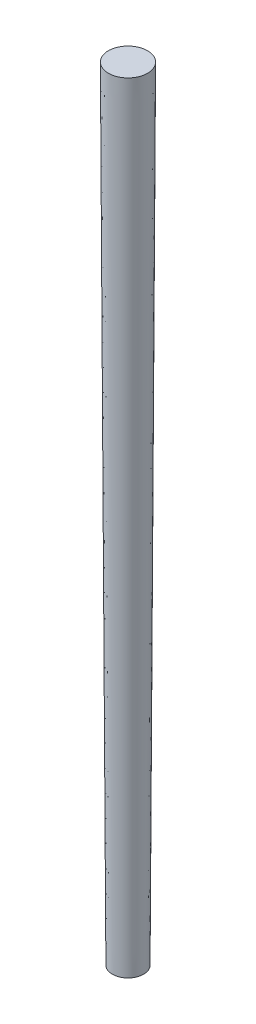
ISO-10303-21;
HEADER;
FILE_DESCRIPTION(('STEP AP214'),'2;1');
FILE_NAME('part.step','',(''),(''),'','','');
FILE_SCHEMA(('AUTOMOTIVE_DESIGN { 1 0 10303 214 1 1 1 1 }'));
ENDSEC;
DATA;
#1=APPLICATION_CONTEXT('core data for automotive mechanical design processes');
#2=APPLICATION_PROTOCOL_DEFINITION('international standard','automotive_design',2000,#1);
#3=PRODUCT_CONTEXT('',#1,'mechanical');
#4=PRODUCT('Part','Part','',(#3));
#5=PRODUCT_RELATED_PRODUCT_CATEGORY('part','',(#4));
#6=PRODUCT_DEFINITION_FORMATION('','',#4);
#7=PRODUCT_DEFINITION_CONTEXT('part definition',#1,'design');
#8=PRODUCT_DEFINITION('design','',#6,#7);
#9=PRODUCT_DEFINITION_SHAPE('','',#8);
#10=(LENGTH_UNIT() NAMED_UNIT(*) SI_UNIT(.MILLI.,.METRE.));
#11=(NAMED_UNIT(*) PLANE_ANGLE_UNIT() SI_UNIT($,.RADIAN.));
#12=(NAMED_UNIT(*) SI_UNIT($,.STERADIAN.) SOLID_ANGLE_UNIT());
#13=UNCERTAINTY_MEASURE_WITH_UNIT(LENGTH_MEASURE(1.E-05),#10,'distance_accuracy_value','');
#14=(GEOMETRIC_REPRESENTATION_CONTEXT(3) GLOBAL_UNCERTAINTY_ASSIGNED_CONTEXT((#13)) GLOBAL_UNIT_ASSIGNED_CONTEXT((#10,
#11,#12)) REPRESENTATION_CONTEXT('',''));
#15=CARTESIAN_POINT('',(0.,0.,0.));
#16=DIRECTION('',(0.,0.,1.));
#17=DIRECTION('',(1.,0.,0.));
#18=AXIS2_PLACEMENT_3D('',#15,#16,#17);
#19=CARTESIAN_POINT('',(0.,63.5,0.));
#20=DIRECTION('',(0.,1.,0.));
#21=DIRECTION('',(0.,0.,1.));
#22=AXIS2_PLACEMENT_3D('',#19,#20,#21);
#23=PLANE('',#22);
#24=CARTESIAN_POINT('',(0.,63.5,0.));
#25=DIRECTION('',(0.,1.,0.));
#26=DIRECTION('',(0.,0.,1.));
#27=AXIS2_PLACEMENT_3D('',#24,#25,#26);
#28=CIRCLE('',#27,3.175);
#29=CARTESIAN_POINT('',(0.,63.5,3.175));
#30=VERTEX_POINT('',#29);
#31=EDGE_CURVE('E10',#30,#30,#28,.T.);
#32=ORIENTED_EDGE('',*,*,#31,.T.);
#33=EDGE_LOOP('',(#32));
#34=FACE_BOUND('',#33,.T.);
#35=ADVANCED_FACE('F31',(#34),#23,.T.);
#36=CARTESIAN_POINT('',(0.,63.5,0.));
#37=DIRECTION('',(0.,1.,0.));
#38=DIRECTION('',(0.,0.,1.));
#39=AXIS2_PLACEMENT_3D('',#36,#37,#38);
#40=CONICAL_SURFACE('',#39,3.175,0.00499995833395832);
#41=CARTESIAN_POINT('',(0.,-63.5,0.));
#42=DIRECTION('',(0.,1.,0.));
#43=DIRECTION('',(0.,0.,1.));
#44=AXIS2_PLACEMENT_3D('',#41,#42,#43);
#45=CIRCLE('',#44,2.54);
#46=CARTESIAN_POINT('',(0.,-63.5,2.54));
#47=VERTEX_POINT('',#46);
#48=EDGE_CURVE('E37',#47,#47,#45,.T.);
#49=ORIENTED_EDGE('',*,*,#48,.T.);
#50=EDGE_LOOP('',(#49));
#51=FACE_BOUND('',#50,.T.);
#52=ORIENTED_EDGE('',*,*,#31,.F.);
#53=EDGE_LOOP('',(#52));
#54=FACE_BOUND('',#53,.T.);
#55=ADVANCED_FACE('F43',(#51,#54),#40,.T.);
#56=CARTESIAN_POINT('',(-2.53999999999999,-63.5,0.));
#57=DIRECTION('',(0.,-1.,0.));
#58=DIRECTION('',(0.,0.,-1.));
#59=AXIS2_PLACEMENT_3D('',#56,#57,#58);
#60=PLANE('',#59);
#61=ORIENTED_EDGE('',*,*,#48,.F.);
#62=EDGE_LOOP('',(#61));
#63=FACE_BOUND('',#62,.T.);
#64=ADVANCED_FACE('F46',(#63),#60,.T.);
#65=CLOSED_SHELL('',(#35,#55,#64));
#66=MANIFOLD_SOLID_BREP('B2',#65);
#67=ADVANCED_BREP_SHAPE_REPRESENTATION('',(#18,#66),#14);
#68=SHAPE_DEFINITION_REPRESENTATION(#9,#67);
ENDSEC;
END-ISO-10303-21;
